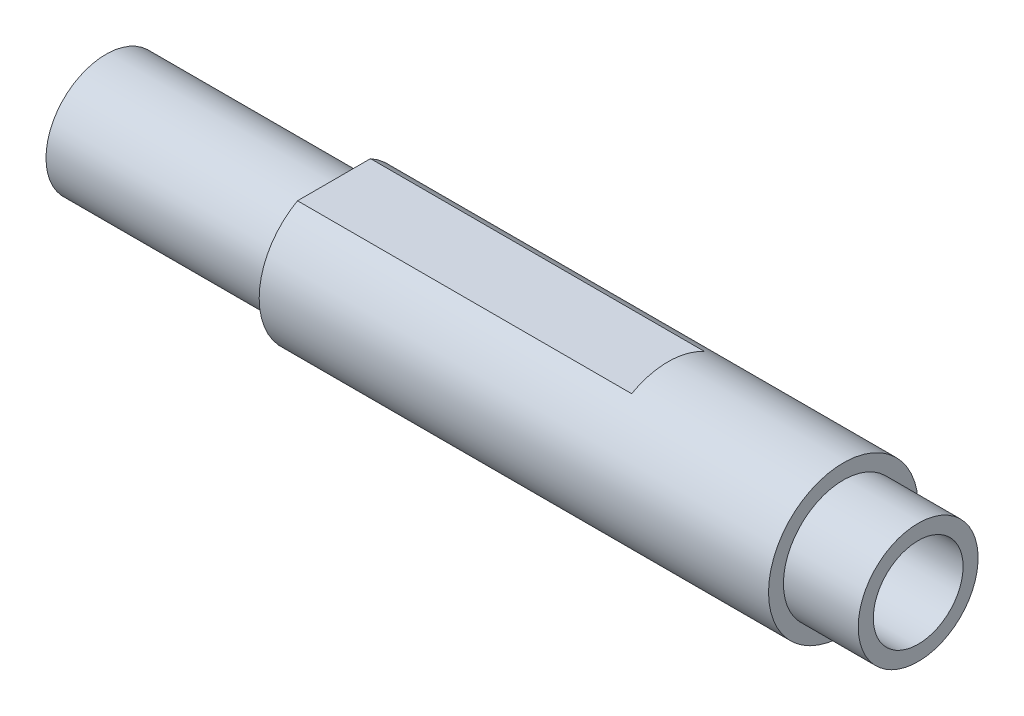
ISO-10303-21;
HEADER;
FILE_DESCRIPTION(('STEP AP214'),'2;1');
FILE_NAME('part.step','',(''),(''),'','','');
FILE_SCHEMA(('AUTOMOTIVE_DESIGN { 1 0 10303 214 1 1 1 1 }'));
ENDSEC;
DATA;
#1=APPLICATION_CONTEXT('core data for automotive mechanical design processes');
#2=APPLICATION_PROTOCOL_DEFINITION('international standard','automotive_design',2000,#1);
#3=PRODUCT_CONTEXT('',#1,'mechanical');
#4=PRODUCT('Part','Part','',(#3));
#5=PRODUCT_RELATED_PRODUCT_CATEGORY('part','',(#4));
#6=PRODUCT_DEFINITION_FORMATION('','',#4);
#7=PRODUCT_DEFINITION_CONTEXT('part definition',#1,'design');
#8=PRODUCT_DEFINITION('design','',#6,#7);
#9=PRODUCT_DEFINITION_SHAPE('','',#8);
#10=(LENGTH_UNIT() NAMED_UNIT(*) SI_UNIT(.MILLI.,.METRE.));
#11=(NAMED_UNIT(*) PLANE_ANGLE_UNIT() SI_UNIT($,.RADIAN.));
#12=(NAMED_UNIT(*) SI_UNIT($,.STERADIAN.) SOLID_ANGLE_UNIT());
#13=UNCERTAINTY_MEASURE_WITH_UNIT(LENGTH_MEASURE(1.E-05),#10,'distance_accuracy_value','');
#14=(GEOMETRIC_REPRESENTATION_CONTEXT(3) GLOBAL_UNCERTAINTY_ASSIGNED_CONTEXT((#13)) GLOBAL_UNIT_ASSIGNED_CONTEXT((#10,
#11,#12)) REPRESENTATION_CONTEXT('',''));
#15=CARTESIAN_POINT('',(0.,0.,0.));
#16=DIRECTION('',(0.,0.,1.));
#17=DIRECTION('',(1.,0.,0.));
#18=AXIS2_PLACEMENT_3D('',#15,#16,#17);
#19=CARTESIAN_POINT('',(-38.276,0.,0.));
#20=DIRECTION('',(1.,0.,0.));
#21=DIRECTION('',(0.,0.,-1.));
#22=AXIS2_PLACEMENT_3D('',#19,#20,#21);
#23=PLANE('',#22);
#24=CARTESIAN_POINT('',(-38.276,0.,0.));
#25=DIRECTION('',(-1.,0.,0.));
#26=DIRECTION('',(0.,0.,1.));
#27=AXIS2_PLACEMENT_3D('',#24,#25,#26);
#28=CIRCLE('',#27,3.17);
#29=CARTESIAN_POINT('',(-38.276,0.,3.17));
#30=VERTEX_POINT('',#29);
#31=EDGE_CURVE('E122',#30,#30,#28,.T.);
#32=ORIENTED_EDGE('',*,*,#31,.F.);
#33=EDGE_LOOP('',(#32));
#34=FACE_BOUND('',#33,.T.);
#35=CARTESIAN_POINT('',(-38.276,0.,0.));
#36=DIRECTION('',(-1.,0.,0.));
#37=DIRECTION('',(0.,0.,1.));
#38=AXIS2_PLACEMENT_3D('',#35,#36,#37);
#39=CIRCLE('',#38,4.00499999999999);
#40=CARTESIAN_POINT('',(-38.276,0.,4.00499999999999));
#41=VERTEX_POINT('',#40);
#42=EDGE_CURVE('E69',#41,#41,#39,.T.);
#43=ORIENTED_EDGE('',*,*,#42,.T.);
#44=EDGE_LOOP('',(#43));
#45=FACE_BOUND('',#44,.T.);
#46=ADVANCED_FACE('F34',(#34,#45),#23,.F.);
#47=CARTESIAN_POINT('',(-1000.,0.,0.));
#48=DIRECTION('',(-1.,0.,0.));
#49=DIRECTION('',(0.,0.,1.));
#50=AXIS2_PLACEMENT_3D('',#47,#48,#49);
#51=CYLINDRICAL_SURFACE('',#50,4.00499999999999);
#52=CARTESIAN_POINT('',(-35.276,-3.71349229163061,1.5));
#53=CARTESIAN_POINT('',(-35.1949842082731,-3.71348949281978,1.50000300429688));
#54=CARTESIAN_POINT('',(-35.1139882491109,-3.71617230656327,1.49341461913386));
#55=CARTESIAN_POINT('',(-34.9544378165209,-3.72653847499091,1.46735491768579));
#56=CARTESIAN_POINT('',(-34.875883274852,-3.734221689775,1.44788396182603));
#57=CARTESIAN_POINT('',(-34.7235641303065,-3.75359885272322,1.39687324533834));
#58=CARTESIAN_POINT('',(-34.6497885656378,-3.76528320567848,1.36536233721454));
#59=CARTESIAN_POINT('',(-34.5085424329658,-3.79133067104156,1.29126837047058));
#60=CARTESIAN_POINT('',(-34.4410737619647,-3.80569458554737,1.24868199501979));
#61=CARTESIAN_POINT('',(-34.3110116201843,-3.83628057648048,1.15138470248508));
#62=CARTESIAN_POINT('',(-34.2487750299524,-3.85255722821583,1.09621375819946));
#63=CARTESIAN_POINT('',(-34.1341860068358,-3.88467935998841,0.97628955344494));
#64=CARTESIAN_POINT('',(-34.0818356755957,-3.90052474773514,0.911534260719435));
#65=CARTESIAN_POINT('',(-33.9867872018284,-3.93064753841623,0.771571726230679));
#66=CARTESIAN_POINT('',(-33.9444768301727,-3.94485349689201,0.696084397176055));
#67=CARTESIAN_POINT('',(-33.8733036976761,-3.96944092065759,0.538437325157578));
#68=CARTESIAN_POINT('',(-33.8444362855074,-3.97982370852193,0.45627990164985));
#69=CARTESIAN_POINT('',(-33.8022197278764,-3.9952075133429,0.291376663569501));
#70=CARTESIAN_POINT('',(-33.7882562049761,-4.00042090976588,0.208808333695109));
#71=CARTESIAN_POINT('',(-33.7742754243588,-4.00564061519012,0.0423467263271937));
#72=CARTESIAN_POINT('',(-33.7742536429791,-4.00564861318173,-0.0415461125688893));
#73=CARTESIAN_POINT('',(-33.7877988127336,-4.00059181174192,-0.203872249185173));
#74=CARTESIAN_POINT('',(-33.8006951879249,-3.99577734473259,-0.282370655556138));
#75=CARTESIAN_POINT('',(-33.8385827967534,-3.98194473236085,-0.435995867698652));
#76=CARTESIAN_POINT('',(-33.8635748866205,-3.97292628940951,-0.511122434373323));
#77=CARTESIAN_POINT('',(-33.9252569190476,-3.95141585243903,-0.657168156894731));
#78=CARTESIAN_POINT('',(-33.9621116609881,-3.93887526069722,-0.72801025656265));
#79=CARTESIAN_POINT('',(-34.046327045557,-3.91158995198378,-0.862680143677286));
#80=CARTESIAN_POINT('',(-34.093691072525,-3.89684452548195,-0.92650566162709));
#81=CARTESIAN_POINT('',(-34.2008130383042,-3.8656537604278,-1.04928115452317));
#82=CARTESIAN_POINT('',(-34.2611330965698,-3.84915943670104,-1.10772898133834));
#83=CARTESIAN_POINT('',(-34.3908179752087,-3.81701861582076,-1.21386832897793));
#84=CARTESIAN_POINT('',(-34.4601850486902,-3.80137233124526,-1.26155716223223));
#85=CARTESIAN_POINT('',(-34.6079717113249,-3.77239085179444,-1.34578104238567));
#86=CARTESIAN_POINT('',(-34.6865574351912,-3.75911435057815,-1.38204640148173));
#87=CARTESIAN_POINT('',(-34.8493487187281,-3.73705445144963,-1.44063907630142));
#88=CARTESIAN_POINT('',(-34.933551131828,-3.72826856132155,-1.46297412463952));
#89=CARTESIAN_POINT('',(-35.1002245271741,-3.71677235258082,-1.49193135007065));
#90=CARTESIAN_POINT('',(-35.1825355656519,-3.71375414290924,-1.49935098092343));
#91=CARTESIAN_POINT('',(-35.3472639087677,-3.71326362065408,-1.5005668743858));
#92=CARTESIAN_POINT('',(-35.4296811818374,-3.71578992715562,-1.4943665291806));
#93=CARTESIAN_POINT('',(-35.5881968883011,-3.72579116523747,-1.46924143342001));
#94=CARTESIAN_POINT('',(-35.664409806173,-3.73302635617803,-1.45093246691668));
#95=CARTESIAN_POINT('',(-35.8126471262417,-3.75134605120455,-1.40288421834248));
#96=CARTESIAN_POINT('',(-35.8846706681223,-3.76243134269895,-1.37314259797425));
#97=CARTESIAN_POINT('',(-36.0254822397879,-3.78771251738736,-1.30182080140593));
#98=CARTESIAN_POINT('',(-36.0940483205601,-3.80200928321033,-1.25983924478799));
#99=CARTESIAN_POINT('',(-36.2234458703904,-3.83193266918368,-1.16565663542292));
#100=CARTESIAN_POINT('',(-36.2842745013079,-3.84755977382154,-1.1134518504664));
#101=CARTESIAN_POINT('',(-36.4004585254716,-3.87957669121567,-0.996400042903749));
#102=CARTESIAN_POINT('',(-36.455224965033,-3.89595228126404,-0.930962512168803));
#103=CARTESIAN_POINT('',(-36.5530696725387,-3.92667409013696,-0.791424393692794));
#104=CARTESIAN_POINT('',(-36.5961479095259,-3.94102030358652,-0.717323783007761));
#105=CARTESIAN_POINT('',(-36.6691082436837,-3.96605620830219,-0.562614169708233));
#106=CARTESIAN_POINT('',(-36.6990361511259,-3.97675856343294,-0.48202893676859));
#107=CARTESIAN_POINT('',(-36.7447436234105,-3.99334120205226,-0.316475755243936));
#108=CARTESIAN_POINT('',(-36.7605298184398,-3.99922374514632,-0.231509880256183));
#109=CARTESIAN_POINT('',(-36.7767921608679,-4.00529040533678,-0.0649313683758605));
#110=CARTESIAN_POINT('',(-36.7781052145711,-4.00578599708303,0.0165889504814171));
#111=CARTESIAN_POINT('',(-36.7675357192775,-4.00183450098157,0.178639017940311));
#112=CARTESIAN_POINT('',(-36.7556547550351,-3.99738800673559,0.259168884332199));
#113=CARTESIAN_POINT('',(-36.7196217593992,-3.98419361606279,0.414966175626019));
#114=CARTESIAN_POINT('',(-36.6957747531611,-3.97555280695756,0.490313907141777));
#115=CARTESIAN_POINT('',(-36.6367900776687,-3.95487219929793,0.635945043041833));
#116=CARTESIAN_POINT('',(-36.6016502713295,-3.94283175743878,0.70622748577046));
#117=CARTESIAN_POINT('',(-36.5193987282717,-3.91592834930039,0.842965225535526));
#118=CARTESIAN_POINT('',(-36.4718462609963,-3.90096809719743,0.909135916296508));
#119=CARTESIAN_POINT('',(-36.366814754803,-3.87006263257811,1.03281707029413));
#120=CARTESIAN_POINT('',(-36.3093321762366,-3.85411707014818,1.09032443170368));
#121=CARTESIAN_POINT('',(-36.1824759337616,-3.82201127411123,1.19816030105949));
#122=CARTESIAN_POINT('',(-36.1126357496873,-3.8058838887736,1.24795188943353));
#123=CARTESIAN_POINT('',(-35.9650698276569,-3.77619217996935,1.33511266477183));
#124=CARTESIAN_POINT('',(-35.8873433105158,-3.76262811014301,1.37248062269434));
#125=CARTESIAN_POINT('',(-35.7225799159019,-3.73932440890321,1.43479766845014));
#126=CARTESIAN_POINT('',(-35.6352870221246,-3.72977315212521,1.45914727315064));
#127=CARTESIAN_POINT('',(-35.4573196394599,-3.71686068667997,1.49174148324129));
#128=CARTESIAN_POINT('',(-35.3666474054859,-3.71349542317983,1.49999663853538));
#129=CARTESIAN_POINT('',(-35.276,-3.71349229163061,1.5));
#130=B_SPLINE_CURVE_WITH_KNOTS('',3,(#52,#53,#54,#55,#56,#57,#58,#59,#60,#61,#62,#63,#64,#65,
#66,#67,#68,#69,#70,#71,#72,#73,#74,#75,#76,#77,#78,#79,#80,#81,#82,#83,#84,#85,#86,#87,#88,#89,
#90,#91,#92,#93,#94,#95,#96,#97,#98,#99,#100,#101,#102,#103,#104,#105,#106,#107,#108,#109,#110,
#111,#112,#113,#114,#115,#116,#117,#118,#119,#120,#121,#122,#123,#124,#125,#126,#127,#128,#129),
.UNSPECIFIED.,.T.,.F.,(4,2,2,2,2,2,2,2,2,2,2,2,2,2,2,2,2,2,2,2,2,2,2,2,2,2,2,2,2,2,2,2,2,2,2,2,
2,2,4),(0.,0.242709849546794,0.485412908906218,0.727537966634314,0.969735618539129,
1.22285145785027,1.47602104470935,1.73778075342909,1.99944982463038,2.24985773443233,
2.50018439459269,2.73815697271959,2.97614639888803,3.21759610931753,3.45912368773011,
3.7147512982697,3.97044269342949,4.23178289060009,4.49297789030909,4.73979121580856,
4.9865430770603,5.221622690877,5.45675041065168,5.70067728365355,5.94469337397903,
6.20413278125615,6.46357287566815,6.72210188162361,6.98050961555496,7.22389080877534,
7.46724277225655,7.70468464242005,7.94217147331389,8.18963001568946,8.43717694886289,
8.69774864569835,8.95834611263915,9.23008886372777,9.50165342760264),.UNSPECIFIED.);
#131=CARTESIAN_POINT('',(-35.276,-3.71349229163061,1.5));
#132=VERTEX_POINT('',#131);
#133=EDGE_CURVE('E80',#132,#132,#130,.T.);
#134=ORIENTED_EDGE('',*,*,#133,.T.);
#135=EDGE_LOOP('',(#134));
#136=FACE_BOUND('',#135,.T.);
#137=ORIENTED_EDGE('',*,*,#42,.F.);
#138=EDGE_LOOP('',(#137));
#139=FACE_BOUND('',#138,.T.);
#140=CARTESIAN_POINT('',(-23.0360000000001,0.,0.));
#141=DIRECTION('',(-1.,0.,0.));
#142=DIRECTION('',(0.,0.,1.));
#143=AXIS2_PLACEMENT_3D('',#140,#141,#142);
#144=CIRCLE('',#143,4.005);
#145=CARTESIAN_POINT('',(-23.0360000000001,0.,4.005));
#146=VERTEX_POINT('',#145);
#147=EDGE_CURVE('E126',#146,#146,#144,.T.);
#148=ORIENTED_EDGE('',*,*,#147,.T.);
#149=EDGE_LOOP('',(#148));
#150=FACE_BOUND('',#149,.T.);
#151=ADVANCED_FACE('F112',(#136,#139,#150),#51,.T.);
#152=CARTESIAN_POINT('',(-23.036,4.005,0.));
#153=DIRECTION('',(1.,0.,0.));
#154=DIRECTION('',(0.,0.,-1.));
#155=AXIS2_PLACEMENT_3D('',#152,#153,#154);
#156=PLANE('',#155);
#157=ORIENTED_EDGE('',*,*,#147,.F.);
#158=EDGE_LOOP('',(#157));
#159=FACE_BOUND('',#158,.T.);
#160=CARTESIAN_POINT('',(-23.0360000000001,0.,0.));
#161=DIRECTION('',(-1.,0.,0.));
#162=DIRECTION('',(0.,0.,1.));
#163=AXIS2_PLACEMENT_3D('',#160,#161,#162);
#164=CIRCLE('',#163,4.99999999999999);
#165=CARTESIAN_POINT('',(-23.0360000000001,4.36499999999999,-2.43860103337959));
#166=VERTEX_POINT('',#165);
#167=CARTESIAN_POINT('',(-23.0360000000001,4.36499999999999,2.43860103337958));
#168=VERTEX_POINT('',#167);
#169=EDGE_CURVE('E128',#166,#168,#164,.T.);
#170=ORIENTED_EDGE('',*,*,#169,.T.);
#171=DIRECTION('',(0.,0.,-1.));
#172=VECTOR('',#171,1.);
#173=CARTESIAN_POINT('',(-23.036,4.36499999999999,0.));
#174=LINE('',#173,#172);
#175=EDGE_CURVE('E53',#168,#166,#174,.T.);
#176=ORIENTED_EDGE('',*,*,#175,.T.);
#177=EDGE_LOOP('',(#170,#176));
#178=FACE_BOUND('',#177,.T.);
#179=ADVANCED_FACE('F117',(#159,#178),#156,.F.);
#180=CARTESIAN_POINT('',(-1000.,0.,0.));
#181=DIRECTION('',(-1.,0.,0.));
#182=DIRECTION('',(0.,0.,1.));
#183=AXIS2_PLACEMENT_3D('',#180,#181,#182);
#184=CYLINDRICAL_SURFACE('',#183,4.99999999999999);
#185=CARTESIAN_POINT('',(-0.707757339388215,0.,0.));
#186=DIRECTION('',(1.,0.,0.));
#187=DIRECTION('',(0.,0.,-1.));
#188=AXIS2_PLACEMENT_3D('',#185,#186,#187);
#189=CIRCLE('',#188,4.99999999999999);
#190=CARTESIAN_POINT('',(-0.707757339388215,4.36499999999999,-2.43860103337959));
#191=VERTEX_POINT('',#190);
#192=CARTESIAN_POINT('',(-0.707757339388201,4.36499999999999,2.43860103337959));
#193=VERTEX_POINT('',#192);
#194=EDGE_CURVE('E41',#191,#193,#189,.T.);
#195=ORIENTED_EDGE('',*,*,#194,.T.);
#196=DIRECTION('',(-1.,0.,0.));
#197=VECTOR('',#196,1.);
#198=CARTESIAN_POINT('',(-1000.,4.36499999999999,2.43860103337959));
#199=LINE('',#198,#197);
#200=EDGE_CURVE('E11',#193,#168,#199,.T.);
#201=ORIENTED_EDGE('',*,*,#200,.T.);
#202=ORIENTED_EDGE('',*,*,#169,.F.);
#203=DIRECTION('',(-1.,0.,0.));
#204=VECTOR('',#203,1.);
#205=CARTESIAN_POINT('',(-1000.,4.36499999999999,-2.43860103337959));
#206=LINE('',#205,#204);
#207=EDGE_CURVE('E68',#166,#191,#206,.F.);
#208=ORIENTED_EDGE('',*,*,#207,.T.);
#209=EDGE_LOOP('',(#195,#201,#202,#208));
#210=FACE_BOUND('',#209,.T.);
#211=CARTESIAN_POINT('',(10.9999999999999,0.,0.));
#212=DIRECTION('',(-1.,0.,0.));
#213=DIRECTION('',(0.,0.,1.));
#214=AXIS2_PLACEMENT_3D('',#211,#212,#213);
#215=CIRCLE('',#214,4.99999999999999);
#216=CARTESIAN_POINT('',(10.9999999999999,0.,4.99999999999999));
#217=VERTEX_POINT('',#216);
#218=EDGE_CURVE('E132',#217,#217,#215,.T.);
#219=ORIENTED_EDGE('',*,*,#218,.T.);
#220=EDGE_LOOP('',(#219));
#221=FACE_BOUND('',#220,.T.);
#222=ADVANCED_FACE('F66',(#210,#221),#184,.T.);
#223=CARTESIAN_POINT('',(11.,4.99999999999999,0.));
#224=DIRECTION('',(-1.,0.,0.));
#225=DIRECTION('',(0.,0.,1.));
#226=AXIS2_PLACEMENT_3D('',#223,#224,#225);
#227=PLANE('',#226);
#228=ORIENTED_EDGE('',*,*,#218,.F.);
#229=EDGE_LOOP('',(#228));
#230=FACE_BOUND('',#229,.T.);
#231=CARTESIAN_POINT('',(10.9999999999999,0.,0.));
#232=DIRECTION('',(-1.,0.,0.));
#233=DIRECTION('',(0.,0.,1.));
#234=AXIS2_PLACEMENT_3D('',#231,#232,#233);
#235=CIRCLE('',#234,4.005);
#236=CARTESIAN_POINT('',(10.9999999999999,0.,4.005));
#237=VERTEX_POINT('',#236);
#238=EDGE_CURVE('E135',#237,#237,#235,.T.);
#239=ORIENTED_EDGE('',*,*,#238,.T.);
#240=EDGE_LOOP('',(#239));
#241=FACE_BOUND('',#240,.T.);
#242=ADVANCED_FACE('F157',(#230,#241),#227,.F.);
#243=CARTESIAN_POINT('',(-1000.,0.,0.));
#244=DIRECTION('',(-1.,0.,0.));
#245=DIRECTION('',(0.,0.,1.));
#246=AXIS2_PLACEMENT_3D('',#243,#244,#245);
#247=CYLINDRICAL_SURFACE('',#246,4.005);
#248=ORIENTED_EDGE('',*,*,#238,.F.);
#249=EDGE_LOOP('',(#248));
#250=FACE_BOUND('',#249,.T.);
#251=CARTESIAN_POINT('',(16.,0.,0.));
#252=DIRECTION('',(-1.,0.,0.));
#253=DIRECTION('',(0.,0.,1.));
#254=AXIS2_PLACEMENT_3D('',#251,#252,#253);
#255=CIRCLE('',#254,4.005);
#256=CARTESIAN_POINT('',(16.,0.,4.005));
#257=VERTEX_POINT('',#256);
#258=EDGE_CURVE('E138',#257,#257,#255,.T.);
#259=ORIENTED_EDGE('',*,*,#258,.T.);
#260=EDGE_LOOP('',(#259));
#261=FACE_BOUND('',#260,.T.);
#262=ADVANCED_FACE('F164',(#250,#261),#247,.T.);
#263=CARTESIAN_POINT('',(16.,4.005,0.));
#264=DIRECTION('',(-1.,0.,0.));
#265=DIRECTION('',(0.,0.,1.));
#266=AXIS2_PLACEMENT_3D('',#263,#264,#265);
#267=PLANE('',#266);
#268=CARTESIAN_POINT('',(16.,0.,0.));
#269=DIRECTION('',(1.,0.,0.));
#270=DIRECTION('',(0.,0.,-1.));
#271=AXIS2_PLACEMENT_3D('',#268,#269,#270);
#272=CIRCLE('',#271,3.);
#273=CARTESIAN_POINT('',(16.,0.,-3.));
#274=VERTEX_POINT('',#273);
#275=EDGE_CURVE('E145',#274,#274,#272,.T.);
#276=ORIENTED_EDGE('',*,*,#275,.F.);
#277=EDGE_LOOP('',(#276));
#278=FACE_BOUND('',#277,.T.);
#279=ORIENTED_EDGE('',*,*,#258,.F.);
#280=EDGE_LOOP('',(#279));
#281=FACE_BOUND('',#280,.T.);
#282=ADVANCED_FACE('F167',(#278,#281),#267,.F.);
#283=CARTESIAN_POINT('',(-35.276,-10.,0.));
#284=DIRECTION('',(0.,1.,0.));
#285=DIRECTION('',(0.,0.,1.));
#286=AXIS2_PLACEMENT_3D('',#283,#284,#285);
#287=CYLINDRICAL_SURFACE('',#286,1.5);
#288=CARTESIAN_POINT('',(-35.276,-2.79265107021984,1.5));
#289=CARTESIAN_POINT('',(-35.1972062558597,-2.79265668968314,1.49999521388118));
#290=CARTESIAN_POINT('',(-35.1182987969997,-2.79603538427456,1.49375099721275));
#291=CARTESIAN_POINT('',(-34.9628553532148,-2.80907796425287,1.46906933105158));
#292=CARTESIAN_POINT('',(-34.8863253049995,-2.81875643640444,1.45060358164575));
#293=CARTESIAN_POINT('',(-34.738172310549,-2.84303308805428,1.40241928341394));
#294=CARTESIAN_POINT('',(-34.6665273792206,-2.85760719637113,1.37275570612326));
#295=CARTESIAN_POINT('',(-34.5292482903263,-2.88999616940522,1.30318442125146));
#296=CARTESIAN_POINT('',(-34.4636138930516,-2.90781090479695,1.26327712244612));
#297=CARTESIAN_POINT('',(-34.3348821326648,-2.94627798507214,1.17090757907538));
#298=CARTESIAN_POINT('',(-34.2723253256114,-2.96704264577933,1.11773840394472));
#299=CARTESIAN_POINT('',(-34.1566032845842,-3.00815878374593,1.00182944743865));
#300=CARTESIAN_POINT('',(-34.1034423382693,-3.02851006863754,0.939085320890408));
#301=CARTESIAN_POINT('',(-34.0049700108455,-3.06794083768187,0.801288824238884));
#302=CARTESIAN_POINT('',(-33.9603044493653,-3.08687505589069,0.725729501206179));
#303=CARTESIAN_POINT('',(-33.8845616721641,-3.11990944511309,0.567106984025997));
#304=CARTESIAN_POINT('',(-33.8534767556899,-3.13401235468428,0.484048074763052));
#305=CARTESIAN_POINT('',(-33.8078557748164,-3.15499046671087,0.318494588354005));
#306=CARTESIAN_POINT('',(-33.7923772092172,-3.16227509159348,0.236312750116593));
#307=CARTESIAN_POINT('',(-33.7753241721154,-3.17031034012954,0.0702190824090951));
#308=CARTESIAN_POINT('',(-33.773742273048,-3.17106445424236,-0.0136917988695774));
#309=CARTESIAN_POINT('',(-33.7841189728587,-3.16616410611633,-0.173856458598005));
#310=CARTESIAN_POINT('',(-33.7950299323938,-3.16100544761181,-0.250196525172755));
#311=CARTESIAN_POINT('',(-33.8282348435385,-3.14558555015933,-0.399811157529356));
#312=CARTESIAN_POINT('',(-33.8505296413666,-3.13532393188389,-0.473085494981797));
#313=CARTESIAN_POINT('',(-33.9060677870606,-3.11046468627135,-0.615824889546044));
#314=CARTESIAN_POINT('',(-33.9394678838969,-3.09580529287096,-0.685217755138115));
#315=CARTESIAN_POINT('',(-34.0160797204182,-3.06351001357856,-0.817591268338452));
#316=CARTESIAN_POINT('',(-34.0592950523133,-3.04587303855014,-0.880569556066185));
#317=CARTESIAN_POINT('',(-34.1586444521376,-3.00750815127855,-1.00415991775555));
#318=CARTESIAN_POINT('',(-34.2155749531088,-2.9866448234956,-1.06409043501788));
#319=CARTESIAN_POINT('',(-34.3385749863461,-2.94521870097062,-1.17389864940138));
#320=CARTESIAN_POINT('',(-34.4046502442809,-2.92465610350896,-1.22376999987572));
#321=CARTESIAN_POINT('',(-34.5483301600903,-2.88502996184398,-1.31456697365191));
#322=CARTESIAN_POINT('',(-34.6263568527875,-2.8661008908094,-1.35488899021116));
#323=CARTESIAN_POINT('',(-34.7892089966475,-2.83364318468714,-1.42153270907536));
#324=CARTESIAN_POINT('',(-34.8740279392535,-2.82010945224081,-1.44786763383229));
#325=CARTESIAN_POINT('',(-35.0412495141452,-2.80136470794331,-1.48379230334144));
#326=CARTESIAN_POINT('',(-35.1233480584552,-2.79560065076911,-1.49449990593976));
#327=CARTESIAN_POINT('',(-35.2883534092245,-2.79146330637038,-1.50221768701763));
#328=CARTESIAN_POINT('',(-35.3712597417189,-2.79308591829613,-1.49923546565542));
#329=CARTESIAN_POINT('',(-35.5273513261202,-2.80295613131533,-1.4806835134705));
#330=CARTESIAN_POINT('',(-35.6007243457547,-2.81057450487467,-1.4663084489562));
#331=CARTESIAN_POINT('',(-35.7439065604351,-2.83068987065989,-1.42708683136664));
#332=CARTESIAN_POINT('',(-35.8137147291638,-2.84318825898288,-1.40223728154036));
#333=CARTESIAN_POINT('',(-35.9514275690897,-2.87234357832715,-1.34153705105514));
#334=CARTESIAN_POINT('',(-36.0190953042848,-2.88916595446878,-1.30523116524787));
#335=CARTESIAN_POINT('',(-36.1477527589179,-2.92489753505401,-1.22306188312139));
#336=CARTESIAN_POINT('',(-36.2087391199866,-2.9438077794563,-1.1771937136731));
#337=CARTESIAN_POINT('',(-36.3293374440221,-2.98409776050649,-1.07126572706825));
#338=CARTESIAN_POINT('',(-36.3880540973874,-3.00551961760286,-1.01019812817323));
#339=CARTESIAN_POINT('',(-36.4946470974618,-3.04656829156162,-0.878672418030017));
#340=CARTESIAN_POINT('',(-36.5425209240597,-3.06619469048957,-0.808212129747249));
#341=CARTESIAN_POINT('',(-36.6266738064886,-3.10189316356288,-0.658175804002492));
#342=CARTESIAN_POINT('',(-36.6627457036925,-3.11790035122232,-0.578467094815835));
#343=CARTESIAN_POINT('',(-36.720634313612,-3.14407320468705,-0.413141305874034));
#344=CARTESIAN_POINT('',(-36.7424622152263,-3.15424345474661,-0.327528922150321));
#345=CARTESIAN_POINT('',(-36.7695526319782,-3.16693413958003,-0.160700432494453));
#346=CARTESIAN_POINT('',(-36.7760677026783,-3.17003234389833,-0.079730937302752));
#347=CARTESIAN_POINT('',(-36.7759312952661,-3.16996718202941,0.0821835313101889));
#348=CARTESIAN_POINT('',(-36.7692835141834,-3.16680557402596,0.163128505232208));
#349=CARTESIAN_POINT('',(-36.7438800699886,-3.15491008142775,0.318046155747691));
#350=CARTESIAN_POINT('',(-36.725809014568,-3.14649157407567,0.392157665098556));
#351=CARTESIAN_POINT('',(-36.6789329678789,-3.1251698341155,0.536208201676666));
#352=CARTESIAN_POINT('',(-36.6501262729969,-3.11226588974587,0.606146564632587));
#353=CARTESIAN_POINT('',(-36.5812022022972,-3.0824414706635,0.743375776386988));
#354=CARTESIAN_POINT('',(-36.5406339005059,-3.06536629124005,0.810405575710827));
#355=CARTESIAN_POINT('',(-36.4499273285233,-3.02907222840473,0.936997966008601));
#356=CARTESIAN_POINT('',(-36.3997847081939,-3.00985237220466,0.996557142208182));
#357=CARTESIAN_POINT('',(-36.2861045410371,-2.96919960382988,1.11213085977622));
#358=CARTESIAN_POINT('',(-36.2217685943461,-2.94772291720489,1.16734717003219));
#359=CARTESIAN_POINT('',(-36.0842843007595,-2.90653207986836,1.26643557312881));
#360=CARTESIAN_POINT('',(-36.0111295058547,-2.88681923738595,1.31029929073428));
#361=CARTESIAN_POINT('',(-35.8563106004745,-2.85129729569065,1.38592387529949));
#362=CARTESIAN_POINT('',(-35.7745251462922,-2.83555861642291,1.41747119537548));
#363=CARTESIAN_POINT('',(-35.6058948870968,-2.81084548723957,1.46588111496981));
#364=CARTESIAN_POINT('',(-35.5190681260871,-2.80184834330051,1.48279301176416));
#365=CARTESIAN_POINT('',(-35.4055747075499,-2.7955347877157,1.49461971313864));
#366=CARTESIAN_POINT('',(-35.3797170487848,-2.79445635244418,1.49663483244326));
#367=CARTESIAN_POINT('',(-35.3279103780727,-2.79301354956203,1.49932579880446));
#368=CARTESIAN_POINT('',(-35.3019613614943,-2.79264921869063,1.50000157695465));
#369=CARTESIAN_POINT('',(-35.276,-2.79265107021984,1.5));
#370=B_SPLINE_CURVE_WITH_KNOTS('',3,(#288,#289,#290,#291,#292,#293,#294,#295,#296,#297,#298,
#299,#300,#301,#302,#303,#304,#305,#306,#307,#308,#309,#310,#311,#312,#313,#314,#315,#316,#317,
#318,#319,#320,#321,#322,#323,#324,#325,#326,#327,#328,#329,#330,#331,#332,#333,#334,#335,#336,
#337,#338,#339,#340,#341,#342,#343,#344,#345,#346,#347,#348,#349,#350,#351,#352,#353,#354,#355,
#356,#357,#358,#359,#360,#361,#362,#363,#364,#365,#366,#367,#368,#369),.UNSPECIFIED.,.T.,.F.,(4,
2,2,2,2,2,2,2,2,2,2,2,2,2,2,2,2,2,2,2,2,2,2,2,2,2,2,2,2,2,2,2,2,2,2,2,2,2,2,2,4),(0.,
0.236272117955592,0.473093265590781,0.708766636559494,0.944430604442057,1.19740640738568,
1.4504973556138,1.71847838587022,1.98630726262633,2.23676665661966,2.48709217558227,
2.71787150051463,2.94866798294656,3.18287114398406,3.41716015793309,3.6718149629642,
3.92662993862605,4.19475972740621,4.46263559120037,4.71020889690619,4.95764477435348,
5.18210235261412,5.40662419183786,5.6415187537365,5.87653084803742,6.13749246630342,
6.39851467568133,6.66389940654916,6.92907542149297,7.17166598980433,7.41418843174528,
7.6433992538636,7.87264646440502,8.11221713374321,8.35189691331531,8.61309379906558,
8.87448283383905,9.14022157568347,9.40506169217623,9.48290582025444,9.56075395315136),.UNSPECIFIED.);
#371=CARTESIAN_POINT('',(-35.276,-2.79265107021984,1.5));
#372=VERTEX_POINT('',#371);
#373=EDGE_CURVE('E72',#372,#372,#370,.T.);
#374=ORIENTED_EDGE('',*,*,#373,.T.);
#375=EDGE_LOOP('',(#374));
#376=FACE_BOUND('',#375,.T.);
#377=ORIENTED_EDGE('',*,*,#133,.F.);
#378=EDGE_LOOP('',(#377));
#379=FACE_BOUND('',#378,.T.);
#380=ADVANCED_FACE('F86',(#376,#379),#287,.F.);
#381=CARTESIAN_POINT('',(-31.276,0.,0.));
#382=DIRECTION('',(-1.,0.,0.));
#383=DIRECTION('',(0.,0.,1.));
#384=AXIS2_PLACEMENT_3D('',#381,#382,#383);
#385=CYLINDRICAL_SURFACE('',#384,3.17);
#386=ORIENTED_EDGE('',*,*,#31,.T.);
#387=EDGE_LOOP('',(#386));
#388=FACE_BOUND('',#387,.T.);
#389=CARTESIAN_POINT('',(-31.276,0.,0.));
#390=DIRECTION('',(-1.,0.,0.));
#391=DIRECTION('',(0.,0.,1.));
#392=AXIS2_PLACEMENT_3D('',#389,#390,#391);
#393=CIRCLE('',#392,3.17);
#394=CARTESIAN_POINT('',(-31.276,0.,3.17));
#395=VERTEX_POINT('',#394);
#396=EDGE_CURVE('E81',#395,#395,#393,.T.);
#397=ORIENTED_EDGE('',*,*,#396,.F.);
#398=EDGE_LOOP('',(#397));
#399=FACE_BOUND('',#398,.T.);
#400=ORIENTED_EDGE('',*,*,#373,.F.);
#401=EDGE_LOOP('',(#400));
#402=FACE_BOUND('',#401,.T.);
#403=ADVANCED_FACE('F89',(#388,#399,#402),#385,.F.);
#404=CARTESIAN_POINT('',(-31.276,0.,0.));
#405=DIRECTION('',(-1.,0.,0.));
#406=DIRECTION('',(0.,0.,1.));
#407=AXIS2_PLACEMENT_3D('',#404,#405,#406);
#408=PLANE('',#407);
#409=ORIENTED_EDGE('',*,*,#396,.T.);
#410=EDGE_LOOP('',(#409));
#411=FACE_BOUND('',#410,.T.);
#412=ADVANCED_FACE('F93',(#411),#408,.T.);
#413=CARTESIAN_POINT('',(-16.5,0.,0.));
#414=DIRECTION('',(1.,0.,0.));
#415=DIRECTION('',(0.,0.,-1.));
#416=AXIS2_PLACEMENT_3D('',#413,#414,#415);
#417=CYLINDRICAL_SURFACE('',#416,3.);
#418=CARTESIAN_POINT('',(-16.5,0.,0.));
#419=DIRECTION('',(1.,0.,0.));
#420=DIRECTION('',(0.,0.,-1.));
#421=AXIS2_PLACEMENT_3D('',#418,#419,#420);
#422=CIRCLE('',#421,3.);
#423=CARTESIAN_POINT('',(-16.5,0.,-3.));
#424=VERTEX_POINT('',#423);
#425=EDGE_CURVE('E142',#424,#424,#422,.T.);
#426=ORIENTED_EDGE('',*,*,#425,.F.);
#427=EDGE_LOOP('',(#426));
#428=FACE_BOUND('',#427,.T.);
#429=ORIENTED_EDGE('',*,*,#275,.T.);
#430=EDGE_LOOP('',(#429));
#431=FACE_BOUND('',#430,.T.);
#432=ADVANCED_FACE('F97',(#428,#431),#417,.F.);
#433=CARTESIAN_POINT('',(-16.5,0.,0.));
#434=DIRECTION('',(1.,0.,0.));
#435=DIRECTION('',(0.,0.,-1.));
#436=AXIS2_PLACEMENT_3D('',#433,#434,#435);
#437=PLANE('',#436);
#438=ORIENTED_EDGE('',*,*,#425,.T.);
#439=EDGE_LOOP('',(#438));
#440=FACE_BOUND('',#439,.T.);
#441=ADVANCED_FACE('F101',(#440),#437,.T.);
#442=CARTESIAN_POINT('',(-0.707757339388201,9.50124468913656,-12.7));
#443=DIRECTION('',(1.,0.,0.));
#444=DIRECTION('',(0.,0.,-1.));
#445=AXIS2_PLACEMENT_3D('',#442,#443,#444);
#446=PLANE('',#445);
#447=DIRECTION('',(0.,0.,1.));
#448=VECTOR('',#447,1.);
#449=CARTESIAN_POINT('',(-0.707757339388201,4.36499999999999,-12.7));
#450=LINE('',#449,#448);
#451=EDGE_CURVE('E48',#191,#193,#450,.T.);
#452=ORIENTED_EDGE('',*,*,#451,.T.);
#453=ORIENTED_EDGE('',*,*,#194,.F.);
#454=EDGE_LOOP('',(#452,#453));
#455=FACE_BOUND('',#454,.T.);
#456=ADVANCED_FACE('F63',(#455),#446,.F.);
#457=CARTESIAN_POINT('',(-25.5110465314652,4.36499999999999,-12.7));
#458=DIRECTION('',(0.,-1.,0.));
#459=DIRECTION('',(0.,0.,-1.));
#460=AXIS2_PLACEMENT_3D('',#457,#458,#459);
#461=PLANE('',#460);
#462=ORIENTED_EDGE('',*,*,#451,.F.);
#463=ORIENTED_EDGE('',*,*,#207,.F.);
#464=ORIENTED_EDGE('',*,*,#175,.F.);
#465=ORIENTED_EDGE('',*,*,#200,.F.);
#466=EDGE_LOOP('',(#462,#463,#464,#465));
#467=FACE_BOUND('',#466,.T.);
#468=ADVANCED_FACE('F57',(#467),#461,.F.);
#469=CLOSED_SHELL('',(#46,#151,#179,#222,#242,#262,#282,#380,#403,#412,#432,#441,#456,#468));
#470=MANIFOLD_SOLID_BREP('B2',#469);
#471=ADVANCED_BREP_SHAPE_REPRESENTATION('',(#18,#470),#14);
#472=SHAPE_DEFINITION_REPRESENTATION(#9,#471);
ENDSEC;
END-ISO-10303-21;
